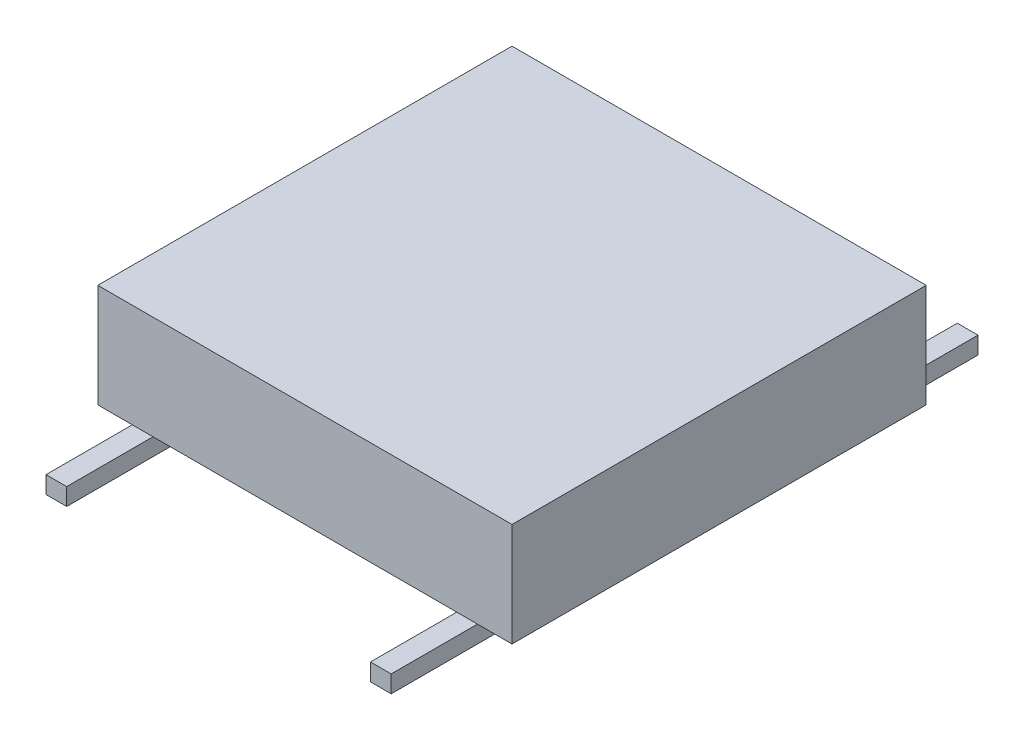
ISO-10303-21;
HEADER;
FILE_DESCRIPTION(('STEP AP214'),'2;1');
FILE_NAME('part.step','',(''),(''),'','','');
FILE_SCHEMA(('AUTOMOTIVE_DESIGN { 1 0 10303 214 1 1 1 1 }'));
ENDSEC;
DATA;
#1=APPLICATION_CONTEXT('core data for automotive mechanical design processes');
#2=APPLICATION_PROTOCOL_DEFINITION('international standard','automotive_design',2000,#1);
#3=PRODUCT_CONTEXT('',#1,'mechanical');
#4=PRODUCT('Part','Part','',(#3));
#5=PRODUCT_RELATED_PRODUCT_CATEGORY('part','',(#4));
#6=PRODUCT_DEFINITION_FORMATION('','',#4);
#7=PRODUCT_DEFINITION_CONTEXT('part definition',#1,'design');
#8=PRODUCT_DEFINITION('design','',#6,#7);
#9=PRODUCT_DEFINITION_SHAPE('','',#8);
#10=(LENGTH_UNIT() NAMED_UNIT(*) SI_UNIT(.MILLI.,.METRE.));
#11=(NAMED_UNIT(*) PLANE_ANGLE_UNIT() SI_UNIT($,.RADIAN.));
#12=(NAMED_UNIT(*) SI_UNIT($,.STERADIAN.) SOLID_ANGLE_UNIT());
#13=UNCERTAINTY_MEASURE_WITH_UNIT(LENGTH_MEASURE(1.E-05),#10,'distance_accuracy_value','');
#14=(GEOMETRIC_REPRESENTATION_CONTEXT(3) GLOBAL_UNCERTAINTY_ASSIGNED_CONTEXT((#13)) GLOBAL_UNIT_ASSIGNED_CONTEXT((#10,
#11,#12)) REPRESENTATION_CONTEXT('',''));
#15=CARTESIAN_POINT('',(0.,0.,0.));
#16=DIRECTION('',(0.,0.,1.));
#17=DIRECTION('',(1.,0.,0.));
#18=AXIS2_PLACEMENT_3D('',#15,#16,#17);
#19=CARTESIAN_POINT('',(0.,0.,0.));
#20=DIRECTION('',(0.,1.,0.));
#21=DIRECTION('',(0.,0.,1.));
#22=AXIS2_PLACEMENT_3D('',#19,#20,#21);
#23=PLANE('',#22);
#24=DIRECTION('',(-1.,0.,0.));
#25=VECTOR('',#24,1.);
#26=CARTESIAN_POINT('',(6.,0.,-6.));
#27=LINE('',#26,#25);
#28=CARTESIAN_POINT('',(-5.,0.,-6.));
#29=VERTEX_POINT('',#28);
#30=CARTESIAN_POINT('',(-6.,0.,-6.));
#31=VERTEX_POINT('',#30);
#32=EDGE_CURVE('E355',#29,#31,#27,.T.);
#33=ORIENTED_EDGE('',*,*,#32,.F.);
#34=DIRECTION('',(0.,0.,1.));
#35=VECTOR('',#34,1.);
#36=CARTESIAN_POINT('',(-5.,0.,-8.5));
#37=LINE('',#36,#35);
#38=CARTESIAN_POINT('',(-5.,0.,-3.5));
#39=VERTEX_POINT('',#38);
#40=EDGE_CURVE('E199',#29,#39,#37,.T.);
#41=ORIENTED_EDGE('',*,*,#40,.T.);
#42=DIRECTION('',(-1.,0.,0.));
#43=VECTOR('',#42,1.);
#44=CARTESIAN_POINT('',(-5.,0.,-3.5));
#45=LINE('',#44,#43);
#46=CARTESIAN_POINT('',(-4.4,0.,-3.5));
#47=VERTEX_POINT('',#46);
#48=EDGE_CURVE('E225',#47,#39,#45,.T.);
#49=ORIENTED_EDGE('',*,*,#48,.F.);
#50=DIRECTION('',(0.,0.,1.));
#51=VECTOR('',#50,1.);
#52=CARTESIAN_POINT('',(-4.4,0.,-8.5));
#53=LINE('',#52,#51);
#54=CARTESIAN_POINT('',(-4.4,0.,-6.));
#55=VERTEX_POINT('',#54);
#56=EDGE_CURVE('E236',#55,#47,#53,.T.);
#57=ORIENTED_EDGE('',*,*,#56,.F.);
#58=CARTESIAN_POINT('',(4.4,0.,-6.));
#59=VERTEX_POINT('',#58);
#60=EDGE_CURVE('E701',#59,#55,#27,.T.);
#61=ORIENTED_EDGE('',*,*,#60,.F.);
#62=DIRECTION('',(0.,0.,1.));
#63=VECTOR('',#62,1.);
#64=CARTESIAN_POINT('',(4.4,0.,-8.5));
#65=LINE('',#64,#63);
#66=CARTESIAN_POINT('',(4.4,0.,-3.5));
#67=VERTEX_POINT('',#66);
#68=EDGE_CURVE('E268',#59,#67,#65,.T.);
#69=ORIENTED_EDGE('',*,*,#68,.T.);
#70=DIRECTION('',(-1.,0.,0.));
#71=VECTOR('',#70,1.);
#72=CARTESIAN_POINT('',(4.4,0.,-3.5));
#73=LINE('',#72,#71);
#74=CARTESIAN_POINT('',(5.,0.,-3.5));
#75=VERTEX_POINT('',#74);
#76=EDGE_CURVE('E253',#75,#67,#73,.T.);
#77=ORIENTED_EDGE('',*,*,#76,.F.);
#78=DIRECTION('',(0.,0.,1.));
#79=VECTOR('',#78,1.);
#80=CARTESIAN_POINT('',(5.,0.,-8.5));
#81=LINE('',#80,#79);
#82=CARTESIAN_POINT('',(5.,0.,-6.));
#83=VERTEX_POINT('',#82);
#84=EDGE_CURVE('E264',#83,#75,#81,.T.);
#85=ORIENTED_EDGE('',*,*,#84,.F.);
#86=CARTESIAN_POINT('',(6.,0.,-6.));
#87=VERTEX_POINT('',#86);
#88=EDGE_CURVE('E337',#87,#83,#27,.T.);
#89=ORIENTED_EDGE('',*,*,#88,.F.);
#90=DIRECTION('',(0.,0.,-1.));
#91=VECTOR('',#90,1.);
#92=CARTESIAN_POINT('',(6.,0.,6.));
#93=LINE('',#92,#91);
#94=CARTESIAN_POINT('',(6.,0.,6.));
#95=VERTEX_POINT('',#94);
#96=EDGE_CURVE('E350',#95,#87,#93,.T.);
#97=ORIENTED_EDGE('',*,*,#96,.F.);
#98=DIRECTION('',(1.,0.,0.));
#99=VECTOR('',#98,1.);
#100=CARTESIAN_POINT('',(6.,0.,6.));
#101=LINE('',#100,#99);
#102=CARTESIAN_POINT('',(5.,0.,6.));
#103=VERTEX_POINT('',#102);
#104=EDGE_CURVE('E346',#103,#95,#101,.T.);
#105=ORIENTED_EDGE('',*,*,#104,.F.);
#106=DIRECTION('',(0.,0.,-1.));
#107=VECTOR('',#106,1.);
#108=CARTESIAN_POINT('',(5.,0.,8.5));
#109=LINE('',#108,#107);
#110=CARTESIAN_POINT('',(5.,0.,3.5));
#111=VERTEX_POINT('',#110);
#112=EDGE_CURVE('E41',#103,#111,#109,.T.);
#113=ORIENTED_EDGE('',*,*,#112,.T.);
#114=DIRECTION('',(-1.,0.,0.));
#115=VECTOR('',#114,1.);
#116=CARTESIAN_POINT('',(4.4,0.,3.5));
#117=LINE('',#116,#115);
#118=CARTESIAN_POINT('',(4.4,0.,3.5));
#119=VERTEX_POINT('',#118);
#120=EDGE_CURVE('E307',#111,#119,#117,.T.);
#121=ORIENTED_EDGE('',*,*,#120,.T.);
#122=DIRECTION('',(0.,0.,-1.));
#123=VECTOR('',#122,1.);
#124=CARTESIAN_POINT('',(4.4,0.,8.5));
#125=LINE('',#124,#123);
#126=CARTESIAN_POINT('',(4.4,0.,6.));
#127=VERTEX_POINT('',#126);
#128=EDGE_CURVE('E11',#127,#119,#125,.T.);
#129=ORIENTED_EDGE('',*,*,#128,.F.);
#130=CARTESIAN_POINT('',(-4.4,0.,6.));
#131=VERTEX_POINT('',#130);
#132=EDGE_CURVE('E352',#131,#127,#101,.T.);
#133=ORIENTED_EDGE('',*,*,#132,.F.);
#134=DIRECTION('',(0.,0.,-1.));
#135=VECTOR('',#134,1.);
#136=CARTESIAN_POINT('',(-4.4,0.,8.5));
#137=LINE('',#136,#135);
#138=CARTESIAN_POINT('',(-4.4,0.,3.5));
#139=VERTEX_POINT('',#138);
#140=EDGE_CURVE('E293',#131,#139,#137,.T.);
#141=ORIENTED_EDGE('',*,*,#140,.T.);
#142=DIRECTION('',(-1.,0.,0.));
#143=VECTOR('',#142,1.);
#144=CARTESIAN_POINT('',(-5.,0.,3.5));
#145=LINE('',#144,#143);
#146=CARTESIAN_POINT('',(-5.,0.,3.5));
#147=VERTEX_POINT('',#146);
#148=EDGE_CURVE('E275',#139,#147,#145,.T.);
#149=ORIENTED_EDGE('',*,*,#148,.T.);
#150=DIRECTION('',(0.,0.,-1.));
#151=VECTOR('',#150,1.);
#152=CARTESIAN_POINT('',(-5.,0.,8.5));
#153=LINE('',#152,#151);
#154=CARTESIAN_POINT('',(-5.,0.,6.));
#155=VERTEX_POINT('',#154);
#156=EDGE_CURVE('E281',#155,#147,#153,.T.);
#157=ORIENTED_EDGE('',*,*,#156,.F.);
#158=CARTESIAN_POINT('',(-6.,0.,6.));
#159=VERTEX_POINT('',#158);
#160=EDGE_CURVE('E347',#159,#155,#101,.T.);
#161=ORIENTED_EDGE('',*,*,#160,.F.);
#162=DIRECTION('',(0.,0.,1.));
#163=VECTOR('',#162,1.);
#164=CARTESIAN_POINT('',(-6.,0.,6.));
#165=LINE('',#164,#163);
#166=EDGE_CURVE('E332',#31,#159,#165,.T.);
#167=ORIENTED_EDGE('',*,*,#166,.F.);
#168=EDGE_LOOP('',(#33,#41,#49,#57,#61,#69,#77,#85,#89,#97,#105,#113,#121,#129,#133,#141,#149,
#157,#161,#167));
#169=FACE_BOUND('',#168,.T.);
#170=ADVANCED_FACE('F32',(#169),#23,.F.);
#171=CARTESIAN_POINT('',(-6.,3.,6.));
#172=DIRECTION('',(1.,0.,0.));
#173=DIRECTION('',(0.,0.,-1.));
#174=AXIS2_PLACEMENT_3D('',#171,#172,#173);
#175=PLANE('',#174);
#176=ORIENTED_EDGE('',*,*,#166,.T.);
#177=DIRECTION('',(0.,-1.,0.));
#178=VECTOR('',#177,1.);
#179=CARTESIAN_POINT('',(-6.,3.,6.));
#180=LINE('',#179,#178);
#181=CARTESIAN_POINT('',(-6.,3.,6.));
#182=VERTEX_POINT('',#181);
#183=EDGE_CURVE('E36',#182,#159,#180,.T.);
#184=ORIENTED_EDGE('',*,*,#183,.F.);
#185=DIRECTION('',(0.,0.,1.));
#186=VECTOR('',#185,1.);
#187=CARTESIAN_POINT('',(-6.,3.,6.));
#188=LINE('',#187,#186);
#189=CARTESIAN_POINT('',(-6.,3.,-6.));
#190=VERTEX_POINT('',#189);
#191=EDGE_CURVE('E333',#190,#182,#188,.T.);
#192=ORIENTED_EDGE('',*,*,#191,.F.);
#193=DIRECTION('',(0.,-1.,0.));
#194=VECTOR('',#193,1.);
#195=CARTESIAN_POINT('',(-6.,3.,-6.));
#196=LINE('',#195,#194);
#197=EDGE_CURVE('E343',#190,#31,#196,.T.);
#198=ORIENTED_EDGE('',*,*,#197,.T.);
#199=EDGE_LOOP('',(#176,#184,#192,#198));
#200=FACE_BOUND('',#199,.T.);
#201=ADVANCED_FACE('F34',(#200),#175,.F.);
#202=CARTESIAN_POINT('',(6.,3.,6.));
#203=DIRECTION('',(0.,0.,-1.));
#204=DIRECTION('',(-1.,0.,0.));
#205=AXIS2_PLACEMENT_3D('',#202,#203,#204);
#206=PLANE('',#205);
#207=ORIENTED_EDGE('',*,*,#160,.T.);
#208=EDGE_CURVE('E351',#155,#131,#101,.T.);
#209=ORIENTED_EDGE('',*,*,#208,.T.);
#210=ORIENTED_EDGE('',*,*,#132,.T.);
#211=EDGE_CURVE('E353',#127,#103,#101,.T.);
#212=ORIENTED_EDGE('',*,*,#211,.T.);
#213=ORIENTED_EDGE('',*,*,#104,.T.);
#214=DIRECTION('',(0.,-1.,0.));
#215=VECTOR('',#214,1.);
#216=CARTESIAN_POINT('',(6.,3.,6.));
#217=LINE('',#216,#215);
#218=CARTESIAN_POINT('',(6.,3.,6.));
#219=VERTEX_POINT('',#218);
#220=EDGE_CURVE('E363',#219,#95,#217,.T.);
#221=ORIENTED_EDGE('',*,*,#220,.F.);
#222=DIRECTION('',(1.,0.,0.));
#223=VECTOR('',#222,1.);
#224=CARTESIAN_POINT('',(6.,3.,6.));
#225=LINE('',#224,#223);
#226=EDGE_CURVE('E336',#182,#219,#225,.T.);
#227=ORIENTED_EDGE('',*,*,#226,.F.);
#228=ORIENTED_EDGE('',*,*,#183,.T.);
#229=EDGE_LOOP('',(#207,#209,#210,#212,#213,#221,#227,#228));
#230=FACE_BOUND('',#229,.T.);
#231=ADVANCED_FACE('F402',(#230),#206,.F.);
#232=CARTESIAN_POINT('',(6.,3.,6.));
#233=DIRECTION('',(-1.,0.,0.));
#234=DIRECTION('',(0.,0.,1.));
#235=AXIS2_PLACEMENT_3D('',#232,#233,#234);
#236=PLANE('',#235);
#237=ORIENTED_EDGE('',*,*,#96,.T.);
#238=DIRECTION('',(0.,-1.,0.));
#239=VECTOR('',#238,1.);
#240=CARTESIAN_POINT('',(6.,3.,-6.));
#241=LINE('',#240,#239);
#242=CARTESIAN_POINT('',(6.,3.,-6.));
#243=VERTEX_POINT('',#242);
#244=EDGE_CURVE('E361',#243,#87,#241,.T.);
#245=ORIENTED_EDGE('',*,*,#244,.F.);
#246=DIRECTION('',(0.,0.,-1.));
#247=VECTOR('',#246,1.);
#248=CARTESIAN_POINT('',(6.,3.,6.));
#249=LINE('',#248,#247);
#250=EDGE_CURVE('E339',#219,#243,#249,.T.);
#251=ORIENTED_EDGE('',*,*,#250,.F.);
#252=ORIENTED_EDGE('',*,*,#220,.T.);
#253=EDGE_LOOP('',(#237,#245,#251,#252));
#254=FACE_BOUND('',#253,.T.);
#255=ADVANCED_FACE('F406',(#254),#236,.F.);
#256=CARTESIAN_POINT('',(6.,3.,-6.));
#257=DIRECTION('',(0.,0.,1.));
#258=DIRECTION('',(1.,0.,0.));
#259=AXIS2_PLACEMENT_3D('',#256,#257,#258);
#260=PLANE('',#259);
#261=ORIENTED_EDGE('',*,*,#88,.T.);
#262=EDGE_CURVE('E358',#83,#59,#27,.T.);
#263=ORIENTED_EDGE('',*,*,#262,.T.);
#264=ORIENTED_EDGE('',*,*,#60,.T.);
#265=EDGE_CURVE('E703',#55,#29,#27,.T.);
#266=ORIENTED_EDGE('',*,*,#265,.T.);
#267=ORIENTED_EDGE('',*,*,#32,.T.);
#268=ORIENTED_EDGE('',*,*,#197,.F.);
#269=DIRECTION('',(-1.,0.,0.));
#270=VECTOR('',#269,1.);
#271=CARTESIAN_POINT('',(6.,3.,-6.));
#272=LINE('',#271,#270);
#273=EDGE_CURVE('E341',#243,#190,#272,.T.);
#274=ORIENTED_EDGE('',*,*,#273,.F.);
#275=ORIENTED_EDGE('',*,*,#244,.T.);
#276=EDGE_LOOP('',(#261,#263,#264,#266,#267,#268,#274,#275));
#277=FACE_BOUND('',#276,.T.);
#278=ADVANCED_FACE('F452',(#277),#260,.F.);
#279=CARTESIAN_POINT('',(0.,3.,0.));
#280=DIRECTION('',(0.,1.,0.));
#281=DIRECTION('',(0.,0.,1.));
#282=AXIS2_PLACEMENT_3D('',#279,#280,#281);
#283=PLANE('',#282);
#284=ORIENTED_EDGE('',*,*,#191,.T.);
#285=ORIENTED_EDGE('',*,*,#226,.T.);
#286=ORIENTED_EDGE('',*,*,#250,.T.);
#287=ORIENTED_EDGE('',*,*,#273,.T.);
#288=EDGE_LOOP('',(#284,#285,#286,#287));
#289=FACE_BOUND('',#288,.T.);
#290=ADVANCED_FACE('F409',(#289),#283,.T.);
#291=CARTESIAN_POINT('',(4.4,0.,8.5));
#292=DIRECTION('',(1.,0.,0.));
#293=DIRECTION('',(0.,0.,-1.));
#294=AXIS2_PLACEMENT_3D('',#291,#292,#293);
#295=PLANE('',#294);
#296=DIRECTION('',(0.,-1.,0.));
#297=VECTOR('',#296,1.);
#298=CARTESIAN_POINT('',(4.4,0.,3.5));
#299=LINE('',#298,#297);
#300=CARTESIAN_POINT('',(4.4,-0.5,3.5));
#301=VERTEX_POINT('',#300);
#302=EDGE_CURVE('E302',#119,#301,#299,.T.);
#303=ORIENTED_EDGE('',*,*,#302,.T.);
#304=DIRECTION('',(0.,0.,-1.));
#305=VECTOR('',#304,1.);
#306=CARTESIAN_POINT('',(4.4,-0.5,8.5));
#307=LINE('',#306,#305);
#308=CARTESIAN_POINT('',(4.4,-0.5,8.5));
#309=VERTEX_POINT('',#308);
#310=EDGE_CURVE('E329',#309,#301,#307,.T.);
#311=ORIENTED_EDGE('',*,*,#310,.F.);
#312=DIRECTION('',(0.,-1.,0.));
#313=VECTOR('',#312,1.);
#314=CARTESIAN_POINT('',(4.4,0.,8.5));
#315=LINE('',#314,#313);
#316=CARTESIAN_POINT('',(4.4,0.,8.5));
#317=VERTEX_POINT('',#316);
#318=EDGE_CURVE('E303',#317,#309,#315,.T.);
#319=ORIENTED_EDGE('',*,*,#318,.F.);
#320=EDGE_CURVE('E43',#317,#127,#125,.T.);
#321=ORIENTED_EDGE('',*,*,#320,.T.);
#322=ORIENTED_EDGE('',*,*,#128,.T.);
#323=EDGE_LOOP('',(#303,#311,#319,#321,#322));
#324=FACE_BOUND('',#323,.T.);
#325=ADVANCED_FACE('F397',(#324),#295,.F.);
#326=CARTESIAN_POINT('',(4.4,-0.5,8.5));
#327=DIRECTION('',(0.,1.,0.));
#328=DIRECTION('',(0.,0.,1.));
#329=AXIS2_PLACEMENT_3D('',#326,#327,#328);
#330=PLANE('',#329);
#331=DIRECTION('',(1.,0.,0.));
#332=VECTOR('',#331,1.);
#333=CARTESIAN_POINT('',(4.4,-0.5,3.5));
#334=LINE('',#333,#332);
#335=CARTESIAN_POINT('',(5.,-0.5,3.5));
#336=VERTEX_POINT('',#335);
#337=EDGE_CURVE('E315',#301,#336,#334,.T.);
#338=ORIENTED_EDGE('',*,*,#337,.T.);
#339=DIRECTION('',(0.,0.,-1.));
#340=VECTOR('',#339,1.);
#341=CARTESIAN_POINT('',(5.,-0.5,8.5));
#342=LINE('',#341,#340);
#343=CARTESIAN_POINT('',(5.,-0.5,8.5));
#344=VERTEX_POINT('',#343);
#345=EDGE_CURVE('E326',#344,#336,#342,.T.);
#346=ORIENTED_EDGE('',*,*,#345,.F.);
#347=DIRECTION('',(1.,0.,0.));
#348=VECTOR('',#347,1.);
#349=CARTESIAN_POINT('',(4.4,-0.5,8.5));
#350=LINE('',#349,#348);
#351=EDGE_CURVE('E306',#309,#344,#350,.T.);
#352=ORIENTED_EDGE('',*,*,#351,.F.);
#353=ORIENTED_EDGE('',*,*,#310,.T.);
#354=EDGE_LOOP('',(#338,#346,#352,#353));
#355=FACE_BOUND('',#354,.T.);
#356=ADVANCED_FACE('F482',(#355),#330,.F.);
#357=CARTESIAN_POINT('',(5.,0.,8.5));
#358=DIRECTION('',(-1.,0.,0.));
#359=DIRECTION('',(0.,0.,1.));
#360=AXIS2_PLACEMENT_3D('',#357,#358,#359);
#361=PLANE('',#360);
#362=DIRECTION('',(0.,1.,0.));
#363=VECTOR('',#362,1.);
#364=CARTESIAN_POINT('',(5.,0.,3.5));
#365=LINE('',#364,#363);
#366=EDGE_CURVE('E317',#336,#111,#365,.T.);
#367=ORIENTED_EDGE('',*,*,#366,.T.);
#368=ORIENTED_EDGE('',*,*,#112,.F.);
#369=CARTESIAN_POINT('',(5.,0.,8.5));
#370=VERTEX_POINT('',#369);
#371=EDGE_CURVE('E323',#370,#103,#109,.T.);
#372=ORIENTED_EDGE('',*,*,#371,.F.);
#373=DIRECTION('',(0.,1.,0.));
#374=VECTOR('',#373,1.);
#375=CARTESIAN_POINT('',(5.,0.,8.5));
#376=LINE('',#375,#374);
#377=EDGE_CURVE('E309',#344,#370,#376,.T.);
#378=ORIENTED_EDGE('',*,*,#377,.F.);
#379=ORIENTED_EDGE('',*,*,#345,.T.);
#380=EDGE_LOOP('',(#367,#368,#372,#378,#379));
#381=FACE_BOUND('',#380,.T.);
#382=ADVANCED_FACE('F379',(#381),#361,.F.);
#383=CARTESIAN_POINT('',(4.4,0.,8.5));
#384=DIRECTION('',(0.,-1.,0.));
#385=DIRECTION('',(0.,0.,-1.));
#386=AXIS2_PLACEMENT_3D('',#383,#384,#385);
#387=PLANE('',#386);
#388=ORIENTED_EDGE('',*,*,#211,.F.);
#389=ORIENTED_EDGE('',*,*,#320,.F.);
#390=DIRECTION('',(-1.,0.,0.));
#391=VECTOR('',#390,1.);
#392=CARTESIAN_POINT('',(4.4,0.,8.5));
#393=LINE('',#392,#391);
#394=EDGE_CURVE('E311',#370,#317,#393,.T.);
#395=ORIENTED_EDGE('',*,*,#394,.F.);
#396=ORIENTED_EDGE('',*,*,#371,.T.);
#397=EDGE_LOOP('',(#388,#389,#395,#396));
#398=FACE_BOUND('',#397,.T.);
#399=ADVANCED_FACE('F385',(#398),#387,.F.);
#400=CARTESIAN_POINT('',(0.,0.,8.5));
#401=DIRECTION('',(0.,0.,1.));
#402=DIRECTION('',(1.,0.,0.));
#403=AXIS2_PLACEMENT_3D('',#400,#401,#402);
#404=PLANE('',#403);
#405=ORIENTED_EDGE('',*,*,#318,.T.);
#406=ORIENTED_EDGE('',*,*,#351,.T.);
#407=ORIENTED_EDGE('',*,*,#377,.T.);
#408=ORIENTED_EDGE('',*,*,#394,.T.);
#409=EDGE_LOOP('',(#405,#406,#407,#408));
#410=FACE_BOUND('',#409,.T.);
#411=ADVANCED_FACE('F389',(#410),#404,.T.);
#412=CARTESIAN_POINT('',(0.,0.,3.5));
#413=DIRECTION('',(0.,0.,1.));
#414=DIRECTION('',(1.,0.,0.));
#415=AXIS2_PLACEMENT_3D('',#412,#413,#414);
#416=PLANE('',#415);
#417=ORIENTED_EDGE('',*,*,#302,.F.);
#418=ORIENTED_EDGE('',*,*,#120,.F.);
#419=ORIENTED_EDGE('',*,*,#366,.F.);
#420=ORIENTED_EDGE('',*,*,#337,.F.);
#421=EDGE_LOOP('',(#417,#418,#419,#420));
#422=FACE_BOUND('',#421,.T.);
#423=ADVANCED_FACE('F395',(#422),#416,.F.);
#424=CARTESIAN_POINT('',(-5.,0.,8.5));
#425=DIRECTION('',(0.,-1.,0.));
#426=DIRECTION('',(0.,0.,-1.));
#427=AXIS2_PLACEMENT_3D('',#424,#425,#426);
#428=PLANE('',#427);
#429=CARTESIAN_POINT('',(-4.4,0.,8.5));
#430=VERTEX_POINT('',#429);
#431=EDGE_CURVE('E294',#430,#131,#137,.T.);
#432=ORIENTED_EDGE('',*,*,#431,.T.);
#433=ORIENTED_EDGE('',*,*,#208,.F.);
#434=CARTESIAN_POINT('',(-5.,0.,8.5));
#435=VERTEX_POINT('',#434);
#436=EDGE_CURVE('E290',#435,#155,#153,.T.);
#437=ORIENTED_EDGE('',*,*,#436,.F.);
#438=DIRECTION('',(-1.,0.,0.));
#439=VECTOR('',#438,1.);
#440=CARTESIAN_POINT('',(-5.,0.,8.5));
#441=LINE('',#440,#439);
#442=EDGE_CURVE('E279',#430,#435,#441,.T.);
#443=ORIENTED_EDGE('',*,*,#442,.F.);
#444=EDGE_LOOP('',(#432,#433,#437,#443));
#445=FACE_BOUND('',#444,.T.);
#446=ADVANCED_FACE('F433',(#445),#428,.F.);
#447=CARTESIAN_POINT('',(-5.,0.,8.5));
#448=DIRECTION('',(1.,0.,0.));
#449=DIRECTION('',(0.,0.,-1.));
#450=AXIS2_PLACEMENT_3D('',#447,#448,#449);
#451=PLANE('',#450);
#452=DIRECTION('',(0.,-1.,0.));
#453=VECTOR('',#452,1.);
#454=CARTESIAN_POINT('',(-5.,0.,3.5));
#455=LINE('',#454,#453);
#456=CARTESIAN_POINT('',(-5.,-0.5,3.5));
#457=VERTEX_POINT('',#456);
#458=EDGE_CURVE('E270',#147,#457,#455,.T.);
#459=ORIENTED_EDGE('',*,*,#458,.T.);
#460=DIRECTION('',(0.,0.,-1.));
#461=VECTOR('',#460,1.);
#462=CARTESIAN_POINT('',(-5.,-0.5,8.5));
#463=LINE('',#462,#461);
#464=CARTESIAN_POINT('',(-5.,-0.5,8.5));
#465=VERTEX_POINT('',#464);
#466=EDGE_CURVE('E299',#465,#457,#463,.T.);
#467=ORIENTED_EDGE('',*,*,#466,.F.);
#468=DIRECTION('',(0.,-1.,0.));
#469=VECTOR('',#468,1.);
#470=CARTESIAN_POINT('',(-5.,0.,8.5));
#471=LINE('',#470,#469);
#472=EDGE_CURVE('E271',#435,#465,#471,.T.);
#473=ORIENTED_EDGE('',*,*,#472,.F.);
#474=ORIENTED_EDGE('',*,*,#436,.T.);
#475=ORIENTED_EDGE('',*,*,#156,.T.);
#476=EDGE_LOOP('',(#459,#467,#473,#474,#475));
#477=FACE_BOUND('',#476,.T.);
#478=ADVANCED_FACE('F419',(#477),#451,.F.);
#479=CARTESIAN_POINT('',(-5.,-0.5,8.5));
#480=DIRECTION('',(0.,1.,0.));
#481=DIRECTION('',(0.,0.,1.));
#482=AXIS2_PLACEMENT_3D('',#479,#480,#481);
#483=PLANE('',#482);
#484=DIRECTION('',(1.,0.,0.));
#485=VECTOR('',#484,1.);
#486=CARTESIAN_POINT('',(-5.,-0.5,3.5));
#487=LINE('',#486,#485);
#488=CARTESIAN_POINT('',(-4.4,-0.5,3.5));
#489=VERTEX_POINT('',#488);
#490=EDGE_CURVE('E284',#457,#489,#487,.T.);
#491=ORIENTED_EDGE('',*,*,#490,.T.);
#492=DIRECTION('',(0.,0.,-1.));
#493=VECTOR('',#492,1.);
#494=CARTESIAN_POINT('',(-4.4,-0.5,8.5));
#495=LINE('',#494,#493);
#496=CARTESIAN_POINT('',(-4.4,-0.5,8.5));
#497=VERTEX_POINT('',#496);
#498=EDGE_CURVE('E296',#497,#489,#495,.T.);
#499=ORIENTED_EDGE('',*,*,#498,.F.);
#500=DIRECTION('',(1.,0.,0.));
#501=VECTOR('',#500,1.);
#502=CARTESIAN_POINT('',(-5.,-0.5,8.5));
#503=LINE('',#502,#501);
#504=EDGE_CURVE('E274',#465,#497,#503,.T.);
#505=ORIENTED_EDGE('',*,*,#504,.F.);
#506=ORIENTED_EDGE('',*,*,#466,.T.);
#507=EDGE_LOOP('',(#491,#499,#505,#506));
#508=FACE_BOUND('',#507,.T.);
#509=ADVANCED_FACE('F427',(#508),#483,.F.);
#510=CARTESIAN_POINT('',(-4.4,0.,8.5));
#511=DIRECTION('',(-1.,0.,0.));
#512=DIRECTION('',(0.,0.,1.));
#513=AXIS2_PLACEMENT_3D('',#510,#511,#512);
#514=PLANE('',#513);
#515=DIRECTION('',(0.,1.,0.));
#516=VECTOR('',#515,1.);
#517=CARTESIAN_POINT('',(-4.4,0.,3.5));
#518=LINE('',#517,#516);
#519=EDGE_CURVE('E286',#489,#139,#518,.T.);
#520=ORIENTED_EDGE('',*,*,#519,.T.);
#521=ORIENTED_EDGE('',*,*,#140,.F.);
#522=ORIENTED_EDGE('',*,*,#431,.F.);
#523=DIRECTION('',(0.,1.,0.));
#524=VECTOR('',#523,1.);
#525=CARTESIAN_POINT('',(-4.4,0.,8.5));
#526=LINE('',#525,#524);
#527=EDGE_CURVE('E277',#497,#430,#526,.T.);
#528=ORIENTED_EDGE('',*,*,#527,.F.);
#529=ORIENTED_EDGE('',*,*,#498,.T.);
#530=EDGE_LOOP('',(#520,#521,#522,#528,#529));
#531=FACE_BOUND('',#530,.T.);
#532=ADVANCED_FACE('F529',(#531),#514,.F.);
#533=CARTESIAN_POINT('',(0.,0.,8.5));
#534=DIRECTION('',(0.,0.,1.));
#535=DIRECTION('',(1.,0.,0.));
#536=AXIS2_PLACEMENT_3D('',#533,#534,#535);
#537=PLANE('',#536);
#538=ORIENTED_EDGE('',*,*,#472,.T.);
#539=ORIENTED_EDGE('',*,*,#504,.T.);
#540=ORIENTED_EDGE('',*,*,#527,.T.);
#541=ORIENTED_EDGE('',*,*,#442,.T.);
#542=EDGE_LOOP('',(#538,#539,#540,#541));
#543=FACE_BOUND('',#542,.T.);
#544=ADVANCED_FACE('F429',(#543),#537,.T.);
#545=CARTESIAN_POINT('',(0.,0.,3.5));
#546=DIRECTION('',(0.,0.,1.));
#547=DIRECTION('',(1.,0.,0.));
#548=AXIS2_PLACEMENT_3D('',#545,#546,#547);
#549=PLANE('',#548);
#550=ORIENTED_EDGE('',*,*,#458,.F.);
#551=ORIENTED_EDGE('',*,*,#148,.F.);
#552=ORIENTED_EDGE('',*,*,#519,.F.);
#553=ORIENTED_EDGE('',*,*,#490,.F.);
#554=EDGE_LOOP('',(#550,#551,#552,#553));
#555=FACE_BOUND('',#554,.T.);
#556=ADVANCED_FACE('F423',(#555),#549,.F.);
#557=CARTESIAN_POINT('',(4.4,0.,-8.5));
#558=DIRECTION('',(0.,1.,0.));
#559=DIRECTION('',(0.,0.,1.));
#560=AXIS2_PLACEMENT_3D('',#557,#558,#559);
#561=PLANE('',#560);
#562=ORIENTED_EDGE('',*,*,#262,.F.);
#563=CARTESIAN_POINT('',(5.,0.,-8.5));
#564=VERTEX_POINT('',#563);
#565=EDGE_CURVE('E265',#564,#83,#81,.T.);
#566=ORIENTED_EDGE('',*,*,#565,.F.);
#567=DIRECTION('',(-1.,0.,0.));
#568=VECTOR('',#567,1.);
#569=CARTESIAN_POINT('',(4.4,0.,-8.5));
#570=LINE('',#569,#568);
#571=CARTESIAN_POINT('',(4.4,0.,-8.5));
#572=VERTEX_POINT('',#571);
#573=EDGE_CURVE('E241',#564,#572,#570,.T.);
#574=ORIENTED_EDGE('',*,*,#573,.T.);
#575=EDGE_CURVE('E58',#572,#59,#65,.T.);
#576=ORIENTED_EDGE('',*,*,#575,.T.);
#577=EDGE_LOOP('',(#562,#566,#574,#576));
#578=FACE_BOUND('',#577,.T.);
#579=ADVANCED_FACE('F553',(#578),#561,.T.);
#580=CARTESIAN_POINT('',(4.4,0.,-8.5));
#581=DIRECTION('',(-1.,0.,0.));
#582=DIRECTION('',(0.,0.,1.));
#583=AXIS2_PLACEMENT_3D('',#580,#581,#582);
#584=PLANE('',#583);
#585=DIRECTION('',(0.,-1.,0.));
#586=VECTOR('',#585,1.);
#587=CARTESIAN_POINT('',(4.4,0.,-3.5));
#588=LINE('',#587,#586);
#589=CARTESIAN_POINT('',(4.4,-0.5,-3.5));
#590=VERTEX_POINT('',#589);
#591=EDGE_CURVE('E201',#67,#590,#588,.T.);
#592=ORIENTED_EDGE('',*,*,#591,.F.);
#593=ORIENTED_EDGE('',*,*,#68,.F.);
#594=ORIENTED_EDGE('',*,*,#575,.F.);
#595=DIRECTION('',(0.,-1.,0.));
#596=VECTOR('',#595,1.);
#597=CARTESIAN_POINT('',(4.4,0.,-8.5));
#598=LINE('',#597,#596);
#599=CARTESIAN_POINT('',(4.4,-0.5,-8.5));
#600=VERTEX_POINT('',#599);
#601=EDGE_CURVE('E238',#572,#600,#598,.T.);
#602=ORIENTED_EDGE('',*,*,#601,.T.);
#603=DIRECTION('',(0.,0.,1.));
#604=VECTOR('',#603,1.);
#605=CARTESIAN_POINT('',(4.4,-0.5,-8.5));
#606=LINE('',#605,#604);
#607=EDGE_CURVE('E250',#600,#590,#606,.T.);
#608=ORIENTED_EDGE('',*,*,#607,.T.);
#609=EDGE_LOOP('',(#592,#593,#594,#602,#608));
#610=FACE_BOUND('',#609,.T.);
#611=ADVANCED_FACE('F587',(#610),#584,.T.);
#612=CARTESIAN_POINT('',(5.,0.,-8.5));
#613=DIRECTION('',(1.,0.,0.));
#614=DIRECTION('',(0.,0.,-1.));
#615=AXIS2_PLACEMENT_3D('',#612,#613,#614);
#616=PLANE('',#615);
#617=DIRECTION('',(0.,1.,0.));
#618=VECTOR('',#617,1.);
#619=CARTESIAN_POINT('',(5.,0.,-3.5));
#620=LINE('',#619,#618);
#621=CARTESIAN_POINT('',(5.,-0.5,-3.5));
#622=VERTEX_POINT('',#621);
#623=EDGE_CURVE('E256',#622,#75,#620,.T.);
#624=ORIENTED_EDGE('',*,*,#623,.F.);
#625=DIRECTION('',(0.,0.,1.));
#626=VECTOR('',#625,1.);
#627=CARTESIAN_POINT('',(5.,-0.5,-8.5));
#628=LINE('',#627,#626);
#629=CARTESIAN_POINT('',(5.,-0.5,-8.5));
#630=VERTEX_POINT('',#629);
#631=EDGE_CURVE('E262',#630,#622,#628,.T.);
#632=ORIENTED_EDGE('',*,*,#631,.F.);
#633=DIRECTION('',(0.,1.,0.));
#634=VECTOR('',#633,1.);
#635=CARTESIAN_POINT('',(5.,0.,-8.5));
#636=LINE('',#635,#634);
#637=EDGE_CURVE('E244',#630,#564,#636,.T.);
#638=ORIENTED_EDGE('',*,*,#637,.T.);
#639=ORIENTED_EDGE('',*,*,#565,.T.);
#640=ORIENTED_EDGE('',*,*,#84,.T.);
#641=EDGE_LOOP('',(#624,#632,#638,#639,#640));
#642=FACE_BOUND('',#641,.T.);
#643=ADVANCED_FACE('F593',(#642),#616,.T.);
#644=CARTESIAN_POINT('',(4.4,-0.5,-8.5));
#645=DIRECTION('',(0.,-1.,0.));
#646=DIRECTION('',(0.,0.,-1.));
#647=AXIS2_PLACEMENT_3D('',#644,#645,#646);
#648=PLANE('',#647);
#649=DIRECTION('',(1.,0.,0.));
#650=VECTOR('',#649,1.);
#651=CARTESIAN_POINT('',(4.4,-0.5,-3.5));
#652=LINE('',#651,#650);
#653=EDGE_CURVE('E242',#590,#622,#652,.T.);
#654=ORIENTED_EDGE('',*,*,#653,.F.);
#655=ORIENTED_EDGE('',*,*,#607,.F.);
#656=DIRECTION('',(1.,0.,0.));
#657=VECTOR('',#656,1.);
#658=CARTESIAN_POINT('',(4.4,-0.5,-8.5));
#659=LINE('',#658,#657);
#660=EDGE_CURVE('E247',#600,#630,#659,.T.);
#661=ORIENTED_EDGE('',*,*,#660,.T.);
#662=ORIENTED_EDGE('',*,*,#631,.T.);
#663=EDGE_LOOP('',(#654,#655,#661,#662));
#664=FACE_BOUND('',#663,.T.);
#665=ADVANCED_FACE('F601',(#664),#648,.T.);
#666=CARTESIAN_POINT('',(0.,0.,-8.5));
#667=DIRECTION('',(0.,0.,-1.));
#668=DIRECTION('',(1.,0.,0.));
#669=AXIS2_PLACEMENT_3D('',#666,#667,#668);
#670=PLANE('',#669);
#671=ORIENTED_EDGE('',*,*,#601,.F.);
#672=ORIENTED_EDGE('',*,*,#573,.F.);
#673=ORIENTED_EDGE('',*,*,#637,.F.);
#674=ORIENTED_EDGE('',*,*,#660,.F.);
#675=EDGE_LOOP('',(#671,#672,#673,#674));
#676=FACE_BOUND('',#675,.T.);
#677=ADVANCED_FACE('F609',(#676),#670,.T.);
#678=CARTESIAN_POINT('',(0.,0.,-3.5));
#679=DIRECTION('',(0.,0.,-1.));
#680=DIRECTION('',(1.,0.,0.));
#681=AXIS2_PLACEMENT_3D('',#678,#679,#680);
#682=PLANE('',#681);
#683=ORIENTED_EDGE('',*,*,#591,.T.);
#684=ORIENTED_EDGE('',*,*,#653,.T.);
#685=ORIENTED_EDGE('',*,*,#623,.T.);
#686=ORIENTED_EDGE('',*,*,#76,.T.);
#687=EDGE_LOOP('',(#683,#684,#685,#686));
#688=FACE_BOUND('',#687,.T.);
#689=ADVANCED_FACE('F617',(#688),#682,.F.);
#690=CARTESIAN_POINT('',(-5.,0.,-8.5));
#691=DIRECTION('',(0.,1.,0.));
#692=DIRECTION('',(0.,0.,1.));
#693=AXIS2_PLACEMENT_3D('',#690,#691,#692);
#694=PLANE('',#693);
#695=ORIENTED_EDGE('',*,*,#265,.F.);
#696=CARTESIAN_POINT('',(-4.4,0.,-8.5));
#697=VERTEX_POINT('',#696);
#698=EDGE_CURVE('E215',#697,#55,#53,.T.);
#699=ORIENTED_EDGE('',*,*,#698,.F.);
#700=DIRECTION('',(-1.,0.,0.));
#701=VECTOR('',#700,1.);
#702=CARTESIAN_POINT('',(-5.,0.,-8.5));
#703=LINE('',#702,#701);
#704=CARTESIAN_POINT('',(-5.,0.,-8.5));
#705=VERTEX_POINT('',#704);
#706=EDGE_CURVE('E207',#697,#705,#703,.T.);
#707=ORIENTED_EDGE('',*,*,#706,.T.);
#708=EDGE_CURVE('E50',#705,#29,#37,.T.);
#709=ORIENTED_EDGE('',*,*,#708,.T.);
#710=EDGE_LOOP('',(#695,#699,#707,#709));
#711=FACE_BOUND('',#710,.T.);
#712=ADVANCED_FACE('F213',(#711),#694,.T.);
#713=CARTESIAN_POINT('',(-5.,0.,-8.5));
#714=DIRECTION('',(-1.,0.,0.));
#715=DIRECTION('',(0.,0.,1.));
#716=AXIS2_PLACEMENT_3D('',#713,#714,#715);
#717=PLANE('',#716);
#718=DIRECTION('',(0.,-1.,0.));
#719=VECTOR('',#718,1.);
#720=CARTESIAN_POINT('',(-5.,0.,-3.5));
#721=LINE('',#720,#719);
#722=CARTESIAN_POINT('',(-5.,-0.5,-3.5));
#723=VERTEX_POINT('',#722);
#724=EDGE_CURVE('E222',#39,#723,#721,.T.);
#725=ORIENTED_EDGE('',*,*,#724,.F.);
#726=ORIENTED_EDGE('',*,*,#40,.F.);
#727=ORIENTED_EDGE('',*,*,#708,.F.);
#728=DIRECTION('',(0.,-1.,0.));
#729=VECTOR('',#728,1.);
#730=CARTESIAN_POINT('',(-5.,0.,-8.5));
#731=LINE('',#730,#729);
#732=CARTESIAN_POINT('',(-5.,-0.5,-8.5));
#733=VERTEX_POINT('',#732);
#734=EDGE_CURVE('E196',#705,#733,#731,.T.);
#735=ORIENTED_EDGE('',*,*,#734,.T.);
#736=DIRECTION('',(0.,0.,1.));
#737=VECTOR('',#736,1.);
#738=CARTESIAN_POINT('',(-5.,-0.5,-8.5));
#739=LINE('',#738,#737);
#740=EDGE_CURVE('E221',#733,#723,#739,.T.);
#741=ORIENTED_EDGE('',*,*,#740,.T.);
#742=EDGE_LOOP('',(#725,#726,#727,#735,#741));
#743=FACE_BOUND('',#742,.T.);
#744=ADVANCED_FACE('F195',(#743),#717,.T.);
#745=CARTESIAN_POINT('',(-4.4,0.,-8.5));
#746=DIRECTION('',(1.,0.,0.));
#747=DIRECTION('',(0.,0.,-1.));
#748=AXIS2_PLACEMENT_3D('',#745,#746,#747);
#749=PLANE('',#748);
#750=DIRECTION('',(0.,1.,0.));
#751=VECTOR('',#750,1.);
#752=CARTESIAN_POINT('',(-4.4,0.,-3.5));
#753=LINE('',#752,#751);
#754=CARTESIAN_POINT('',(-4.4,-0.5,-3.5));
#755=VERTEX_POINT('',#754);
#756=EDGE_CURVE('E228',#755,#47,#753,.T.);
#757=ORIENTED_EDGE('',*,*,#756,.F.);
#758=DIRECTION('',(0.,0.,1.));
#759=VECTOR('',#758,1.);
#760=CARTESIAN_POINT('',(-4.4,-0.5,-8.5));
#761=LINE('',#760,#759);
#762=CARTESIAN_POINT('',(-4.4,-0.5,-8.5));
#763=VERTEX_POINT('',#762);
#764=EDGE_CURVE('E234',#763,#755,#761,.T.);
#765=ORIENTED_EDGE('',*,*,#764,.F.);
#766=DIRECTION('',(0.,1.,0.));
#767=VECTOR('',#766,1.);
#768=CARTESIAN_POINT('',(-4.4,0.,-8.5));
#769=LINE('',#768,#767);
#770=EDGE_CURVE('E216',#763,#697,#769,.T.);
#771=ORIENTED_EDGE('',*,*,#770,.T.);
#772=ORIENTED_EDGE('',*,*,#698,.T.);
#773=ORIENTED_EDGE('',*,*,#56,.T.);
#774=EDGE_LOOP('',(#757,#765,#771,#772,#773));
#775=FACE_BOUND('',#774,.T.);
#776=ADVANCED_FACE('F638',(#775),#749,.T.);
#777=CARTESIAN_POINT('',(-5.,-0.5,-8.5));
#778=DIRECTION('',(0.,-1.,0.));
#779=DIRECTION('',(0.,0.,-1.));
#780=AXIS2_PLACEMENT_3D('',#777,#778,#779);
#781=PLANE('',#780);
#782=DIRECTION('',(1.,0.,0.));
#783=VECTOR('',#782,1.);
#784=CARTESIAN_POINT('',(-5.,-0.5,-3.5));
#785=LINE('',#784,#783);
#786=EDGE_CURVE('E211',#723,#755,#785,.T.);
#787=ORIENTED_EDGE('',*,*,#786,.F.);
#788=ORIENTED_EDGE('',*,*,#740,.F.);
#789=DIRECTION('',(1.,0.,0.));
#790=VECTOR('',#789,1.);
#791=CARTESIAN_POINT('',(-5.,-0.5,-8.5));
#792=LINE('',#791,#790);
#793=EDGE_CURVE('E210',#733,#763,#792,.T.);
#794=ORIENTED_EDGE('',*,*,#793,.T.);
#795=ORIENTED_EDGE('',*,*,#764,.T.);
#796=EDGE_LOOP('',(#787,#788,#794,#795));
#797=FACE_BOUND('',#796,.T.);
#798=ADVANCED_FACE('F645',(#797),#781,.T.);
#799=CARTESIAN_POINT('',(0.,0.,-8.5));
#800=DIRECTION('',(0.,0.,-1.));
#801=DIRECTION('',(1.,0.,0.));
#802=AXIS2_PLACEMENT_3D('',#799,#800,#801);
#803=PLANE('',#802);
#804=ORIENTED_EDGE('',*,*,#734,.F.);
#805=ORIENTED_EDGE('',*,*,#706,.F.);
#806=ORIENTED_EDGE('',*,*,#770,.F.);
#807=ORIENTED_EDGE('',*,*,#793,.F.);
#808=EDGE_LOOP('',(#804,#805,#806,#807));
#809=FACE_BOUND('',#808,.T.);
#810=ADVANCED_FACE('F205',(#809),#803,.T.);
#811=CARTESIAN_POINT('',(0.,0.,-3.5));
#812=DIRECTION('',(0.,0.,-1.));
#813=DIRECTION('',(1.,0.,0.));
#814=AXIS2_PLACEMENT_3D('',#811,#812,#813);
#815=PLANE('',#814);
#816=ORIENTED_EDGE('',*,*,#724,.T.);
#817=ORIENTED_EDGE('',*,*,#786,.T.);
#818=ORIENTED_EDGE('',*,*,#756,.T.);
#819=ORIENTED_EDGE('',*,*,#48,.T.);
#820=EDGE_LOOP('',(#816,#817,#818,#819));
#821=FACE_BOUND('',#820,.T.);
#822=ADVANCED_FACE('F660',(#821),#815,.F.);
#823=CLOSED_SHELL('',(#170,#201,#231,#255,#278,#290,#325,#356,#382,#399,#411,#423,#446,#478,
#509,#532,#544,#556,#579,#611,#643,#665,#677,#689,#712,#744,#776,#798,#810,#822));
#824=MANIFOLD_SOLID_BREP('B2',#823);
#825=ADVANCED_BREP_SHAPE_REPRESENTATION('',(#18,#824),#14);
#826=SHAPE_DEFINITION_REPRESENTATION(#9,#825);
ENDSEC;
END-ISO-10303-21;
